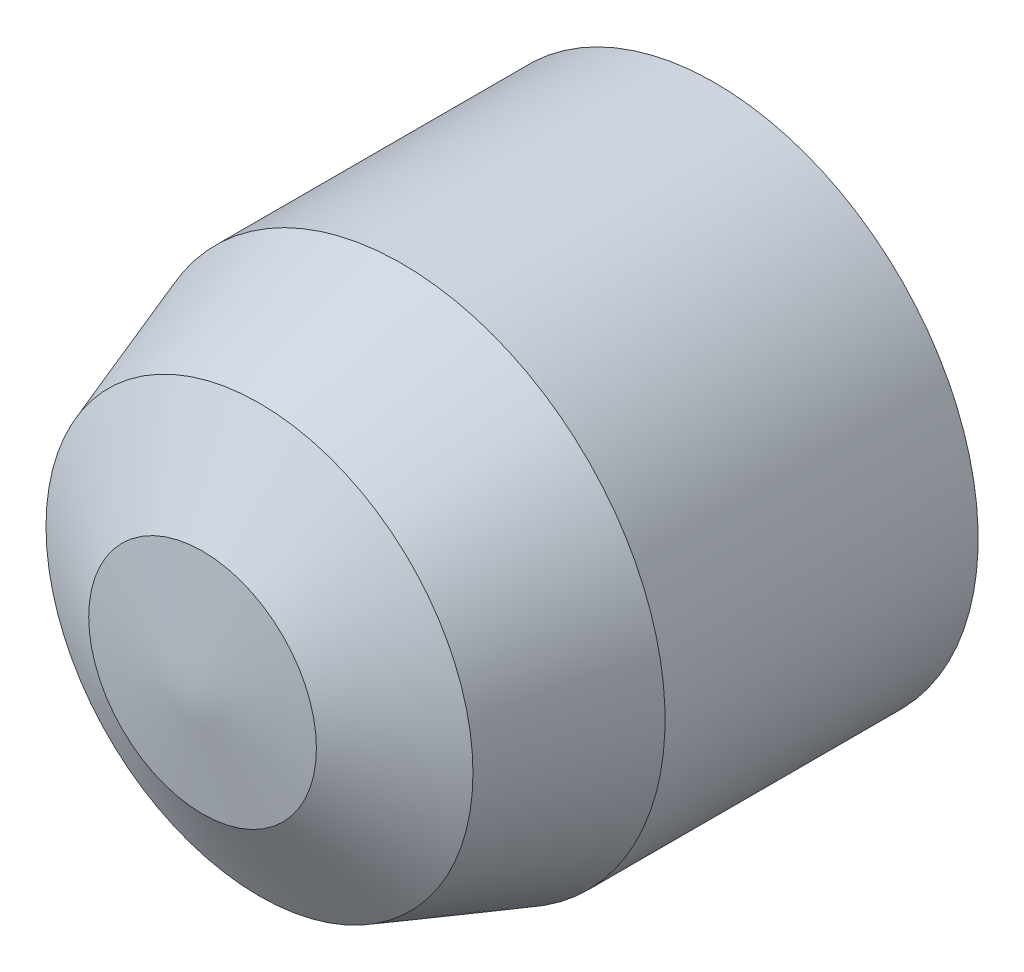
ISO-10303-21;
HEADER;
FILE_DESCRIPTION(('STEP AP214'),'2;1');
FILE_NAME('part.step','',(''),(''),'','','');
FILE_SCHEMA(('AUTOMOTIVE_DESIGN { 1 0 10303 214 1 1 1 1 }'));
ENDSEC;
DATA;
#1=APPLICATION_CONTEXT('core data for automotive mechanical design processes');
#2=APPLICATION_PROTOCOL_DEFINITION('international standard','automotive_design',2000,#1);
#3=PRODUCT_CONTEXT('',#1,'mechanical');
#4=PRODUCT('Part','Part','',(#3));
#5=PRODUCT_RELATED_PRODUCT_CATEGORY('part','',(#4));
#6=PRODUCT_DEFINITION_FORMATION('','',#4);
#7=PRODUCT_DEFINITION_CONTEXT('part definition',#1,'design');
#8=PRODUCT_DEFINITION('design','',#6,#7);
#9=PRODUCT_DEFINITION_SHAPE('','',#8);
#10=(LENGTH_UNIT() NAMED_UNIT(*) SI_UNIT(.MILLI.,.METRE.));
#11=(NAMED_UNIT(*) PLANE_ANGLE_UNIT() SI_UNIT($,.RADIAN.));
#12=(NAMED_UNIT(*) SI_UNIT($,.STERADIAN.) SOLID_ANGLE_UNIT());
#13=UNCERTAINTY_MEASURE_WITH_UNIT(LENGTH_MEASURE(1.E-05),#10,'distance_accuracy_value','');
#14=(GEOMETRIC_REPRESENTATION_CONTEXT(3) GLOBAL_UNCERTAINTY_ASSIGNED_CONTEXT((#13)) GLOBAL_UNIT_ASSIGNED_CONTEXT((#10,
#11,#12)) REPRESENTATION_CONTEXT('',''));
#15=CARTESIAN_POINT('',(0.,0.,0.));
#16=DIRECTION('',(0.,0.,1.));
#17=DIRECTION('',(1.,0.,0.));
#18=AXIS2_PLACEMENT_3D('',#15,#16,#17);
#19=CARTESIAN_POINT('',(860.,225.,896.));
#20=DIRECTION('',(0.,0.,-1.));
#21=DIRECTION('',(-1.,0.,0.));
#22=AXIS2_PLACEMENT_3D('',#19,#20,#21);
#23=CONICAL_SURFACE('',#22,0.,1.44644133224814);
#24=CARTESIAN_POINT('',(860.,225.,894.));
#25=DIRECTION('',(0.,0.,-1.));
#26=DIRECTION('',(-1.,0.,0.));
#27=AXIS2_PLACEMENT_3D('',#24,#25,#26);
#28=CIRCLE('',#27,16.);
#29=CARTESIAN_POINT('',(844.,225.,894.));
#30=VERTEX_POINT('',#29);
#31=EDGE_CURVE('E58',#30,#30,#28,.T.);
#32=ORIENTED_EDGE('',*,*,#31,.F.);
#33=EDGE_LOOP('',(#32));
#34=FACE_BOUND('',#33,.T.);
#35=CARTESIAN_POINT('',(860.,225.,896.));
#36=VERTEX_POINT('',#35);
#37=VERTEX_LOOP('',#36);
#38=FACE_BOUND('',#37,.T.);
#39=ADVANCED_FACE('F41',(#34,#38),#23,.T.);
#40=CARTESIAN_POINT('',(860.,225.,822.));
#41=DIRECTION('',(0.,0.,1.));
#42=DIRECTION('',(1.,0.,0.));
#43=AXIS2_PLACEMENT_3D('',#40,#41,#42);
#44=PLANE('',#43);
#45=CARTESIAN_POINT('',(860.,225.,822.));
#46=DIRECTION('',(0.,0.,-1.));
#47=DIRECTION('',(-1.,0.,0.));
#48=AXIS2_PLACEMENT_3D('',#45,#46,#47);
#49=CIRCLE('',#48,37.);
#50=CARTESIAN_POINT('',(823.,225.,822.));
#51=VERTEX_POINT('',#50);
#52=EDGE_CURVE('E11',#51,#51,#49,.T.);
#53=ORIENTED_EDGE('',*,*,#52,.T.);
#54=EDGE_LOOP('',(#53));
#55=FACE_BOUND('',#54,.T.);
#56=ADVANCED_FACE('F51',(#55),#44,.F.);
#57=CARTESIAN_POINT('',(860.,225.,817.));
#58=DIRECTION('',(0.,0.,-1.));
#59=DIRECTION('',(-1.,0.,0.));
#60=AXIS2_PLACEMENT_3D('',#57,#58,#59);
#61=CYLINDRICAL_SURFACE('',#60,37.);
#62=ORIENTED_EDGE('',*,*,#52,.F.);
#63=EDGE_LOOP('',(#62));
#64=FACE_BOUND('',#63,.T.);
#65=CARTESIAN_POINT('',(860.,225.,866.));
#66=DIRECTION('',(0.,0.,-1.));
#67=DIRECTION('',(-1.,0.,0.));
#68=AXIS2_PLACEMENT_3D('',#65,#66,#67);
#69=CIRCLE('',#68,37.);
#70=CARTESIAN_POINT('',(823.,225.,866.));
#71=VERTEX_POINT('',#70);
#72=EDGE_CURVE('E50',#71,#71,#69,.T.);
#73=ORIENTED_EDGE('',*,*,#72,.T.);
#74=EDGE_LOOP('',(#73));
#75=FACE_BOUND('',#74,.T.);
#76=ADVANCED_FACE('F57',(#64,#75),#61,.T.);
#77=CARTESIAN_POINT('',(860.,225.,886.));
#78=DIRECTION('',(0.,0.,-1.));
#79=DIRECTION('',(-1.,0.,0.));
#80=AXIS2_PLACEMENT_3D('',#77,#78,#79);
#81=CONICAL_SURFACE('',#80,30.,0.336674819386727);
#82=ORIENTED_EDGE('',*,*,#72,.F.);
#83=EDGE_LOOP('',(#82));
#84=FACE_BOUND('',#83,.T.);
#85=CARTESIAN_POINT('',(860.,225.,886.));
#86=DIRECTION('',(0.,0.,-1.));
#87=DIRECTION('',(-1.,0.,0.));
#88=AXIS2_PLACEMENT_3D('',#85,#86,#87);
#89=CIRCLE('',#88,30.);
#90=CARTESIAN_POINT('',(830.,225.,886.));
#91=VERTEX_POINT('',#90);
#92=EDGE_CURVE('E65',#91,#91,#89,.T.);
#93=ORIENTED_EDGE('',*,*,#92,.T.);
#94=EDGE_LOOP('',(#93));
#95=FACE_BOUND('',#94,.T.);
#96=ADVANCED_FACE('F68',(#84,#95),#81,.T.);
#97=CARTESIAN_POINT('',(860.,225.,894.));
#98=DIRECTION('',(0.,0.,-1.));
#99=DIRECTION('',(-1.,0.,0.));
#100=AXIS2_PLACEMENT_3D('',#97,#98,#99);
#101=CONICAL_SURFACE('',#100,16.,1.05165021254837);
#102=ORIENTED_EDGE('',*,*,#92,.F.);
#103=EDGE_LOOP('',(#102));
#104=FACE_BOUND('',#103,.T.);
#105=ORIENTED_EDGE('',*,*,#31,.T.);
#106=EDGE_LOOP('',(#105));
#107=FACE_BOUND('',#106,.T.);
#108=ADVANCED_FACE('F73',(#104,#107),#101,.T.);
#109=CLOSED_SHELL('',(#39,#56,#76,#96,#108));
#110=MANIFOLD_SOLID_BREP('B2',#109);
#111=ADVANCED_BREP_SHAPE_REPRESENTATION('',(#18,#110),#14);
#112=SHAPE_DEFINITION_REPRESENTATION(#9,#111);
ENDSEC;
END-ISO-10303-21;
